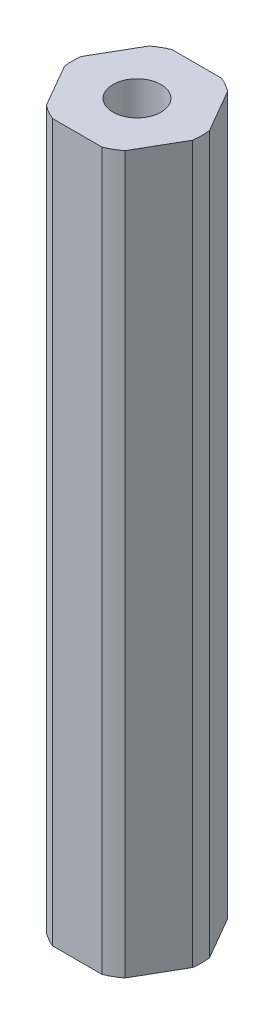
ISO-10303-21;
HEADER;
FILE_DESCRIPTION(('STEP AP214'),'2;1');
FILE_NAME('part.step','',(''),(''),'','','');
FILE_SCHEMA(('AUTOMOTIVE_DESIGN { 1 0 10303 214 1 1 1 1 }'));
ENDSEC;
DATA;
#1=APPLICATION_CONTEXT('core data for automotive mechanical design processes');
#2=APPLICATION_PROTOCOL_DEFINITION('international standard','automotive_design',2000,#1);
#3=PRODUCT_CONTEXT('',#1,'mechanical');
#4=PRODUCT('Part','Part','',(#3));
#5=PRODUCT_RELATED_PRODUCT_CATEGORY('part','',(#4));
#6=PRODUCT_DEFINITION_FORMATION('','',#4);
#7=PRODUCT_DEFINITION_CONTEXT('part definition',#1,'design');
#8=PRODUCT_DEFINITION('design','',#6,#7);
#9=PRODUCT_DEFINITION_SHAPE('','',#8);
#10=(LENGTH_UNIT() NAMED_UNIT(*) SI_UNIT(.MILLI.,.METRE.));
#11=(NAMED_UNIT(*) PLANE_ANGLE_UNIT() SI_UNIT($,.RADIAN.));
#12=(NAMED_UNIT(*) SI_UNIT($,.STERADIAN.) SOLID_ANGLE_UNIT());
#13=UNCERTAINTY_MEASURE_WITH_UNIT(LENGTH_MEASURE(1.E-05),#10,'distance_accuracy_value','');
#14=(GEOMETRIC_REPRESENTATION_CONTEXT(3) GLOBAL_UNCERTAINTY_ASSIGNED_CONTEXT((#13)) GLOBAL_UNIT_ASSIGNED_CONTEXT((#10,
#11,#12)) REPRESENTATION_CONTEXT('',''));
#15=CARTESIAN_POINT('',(0.,0.,0.));
#16=DIRECTION('',(0.,0.,1.));
#17=DIRECTION('',(1.,0.,0.));
#18=AXIS2_PLACEMENT_3D('',#15,#16,#17);
#19=CARTESIAN_POINT('',(0.,38.1,6.35));
#20=DIRECTION('',(0.,0.,-1.));
#21=DIRECTION('',(-1.,0.,0.));
#22=AXIS2_PLACEMENT_3D('',#19,#20,#21);
#23=PLANE('',#22);
#24=DIRECTION('',(1.,0.,0.));
#25=VECTOR('',#24,1.);
#26=CARTESIAN_POINT('',(0.,-38.1,6.35));
#27=LINE('',#26,#25);
#28=CARTESIAN_POINT('',(-2.63701547367474,-38.1,6.35));
#29=VERTEX_POINT('',#28);
#30=CARTESIAN_POINT('',(2.63701547367474,-38.1,6.35));
#31=VERTEX_POINT('',#30);
#32=EDGE_CURVE('E159',#29,#31,#27,.T.);
#33=ORIENTED_EDGE('',*,*,#32,.T.);
#34=DIRECTION('',(0.,-1.,0.));
#35=VECTOR('',#34,1.);
#36=CARTESIAN_POINT('',(2.63701547367474,38.1,6.35));
#37=LINE('',#36,#35);
#38=CARTESIAN_POINT('',(2.63701547367474,38.1,6.35));
#39=VERTEX_POINT('',#38);
#40=EDGE_CURVE('E11',#39,#31,#37,.T.);
#41=ORIENTED_EDGE('',*,*,#40,.F.);
#42=DIRECTION('',(1.,0.,0.));
#43=VECTOR('',#42,1.);
#44=CARTESIAN_POINT('',(0.,38.1,6.35));
#45=LINE('',#44,#43);
#46=CARTESIAN_POINT('',(-2.63701547367474,38.1,6.35));
#47=VERTEX_POINT('',#46);
#48=EDGE_CURVE('E218',#47,#39,#45,.T.);
#49=ORIENTED_EDGE('',*,*,#48,.F.);
#50=DIRECTION('',(0.,-1.,0.));
#51=VECTOR('',#50,1.);
#52=CARTESIAN_POINT('',(-2.63701547367474,38.1,6.35));
#53=LINE('',#52,#51);
#54=EDGE_CURVE('E152',#47,#29,#53,.T.);
#55=ORIENTED_EDGE('',*,*,#54,.T.);
#56=EDGE_LOOP('',(#33,#41,#49,#55));
#57=FACE_BOUND('',#56,.T.);
#58=ADVANCED_FACE('F34',(#57),#23,.F.);
#59=CARTESIAN_POINT('',(0.,38.1,0.));
#60=DIRECTION('',(0.,-1.,0.));
#61=DIRECTION('',(0.,0.,-1.));
#62=AXIS2_PLACEMENT_3D('',#59,#60,#61);
#63=CYLINDRICAL_SURFACE('',#62,6.87578);
#64=CARTESIAN_POINT('',(0.,-38.1,0.));
#65=DIRECTION('',(0.,1.,0.));
#66=DIRECTION('',(0.,0.,1.));
#67=AXIS2_PLACEMENT_3D('',#64,#65,#66);
#68=CIRCLE('',#67,6.87578);
#69=CARTESIAN_POINT('',(4.18075357719382,-38.1,5.45872239037497));
#70=VERTEX_POINT('',#69);
#71=EDGE_CURVE('E162',#31,#70,#68,.T.);
#72=ORIENTED_EDGE('',*,*,#71,.T.);
#73=DIRECTION('',(0.,-1.,0.));
#74=VECTOR('',#73,1.);
#75=CARTESIAN_POINT('',(4.18075357719382,38.1,5.45872239037497));
#76=LINE('',#75,#74);
#77=CARTESIAN_POINT('',(4.18075357719382,38.1,5.45872239037497));
#78=VERTEX_POINT('',#77);
#79=EDGE_CURVE('E43',#78,#70,#76,.T.);
#80=ORIENTED_EDGE('',*,*,#79,.F.);
#81=CARTESIAN_POINT('',(0.,38.1,0.));
#82=DIRECTION('',(0.,1.,0.));
#83=DIRECTION('',(0.,0.,1.));
#84=AXIS2_PLACEMENT_3D('',#81,#82,#83);
#85=CIRCLE('',#84,6.87578);
#86=EDGE_CURVE('E106',#39,#78,#85,.T.);
#87=ORIENTED_EDGE('',*,*,#86,.F.);
#88=ORIENTED_EDGE('',*,*,#40,.T.);
#89=EDGE_LOOP('',(#72,#80,#87,#88));
#90=FACE_BOUND('',#89,.T.);
#91=ADVANCED_FACE('F253',(#90),#63,.T.);
#92=CARTESIAN_POINT('',(5.49926131403119,38.1,3.175));
#93=DIRECTION('',(-0.866025403784439,0.,-0.5));
#94=DIRECTION('',(-0.5,0.,0.866025403784439));
#95=AXIS2_PLACEMENT_3D('',#92,#93,#94);
#96=PLANE('',#95);
#97=DIRECTION('',(0.5,0.,-0.866025403784439));
#98=VECTOR('',#97,1.);
#99=CARTESIAN_POINT('',(5.49926131403119,-38.1,3.175));
#100=LINE('',#99,#98);
#101=CARTESIAN_POINT('',(6.81776905086855,-38.1,0.891277609625022));
#102=VERTEX_POINT('',#101);
#103=EDGE_CURVE('E164',#70,#102,#100,.T.);
#104=ORIENTED_EDGE('',*,*,#103,.T.);
#105=DIRECTION('',(0.,-1.,0.));
#106=VECTOR('',#105,1.);
#107=CARTESIAN_POINT('',(6.81776905086855,38.1,0.891277609625022));
#108=LINE('',#107,#106);
#109=CARTESIAN_POINT('',(6.81776905086855,38.1,0.891277609625022));
#110=VERTEX_POINT('',#109);
#111=EDGE_CURVE('E194',#110,#102,#108,.T.);
#112=ORIENTED_EDGE('',*,*,#111,.F.);
#113=DIRECTION('',(0.5,0.,-0.866025403784439));
#114=VECTOR('',#113,1.);
#115=CARTESIAN_POINT('',(5.49926131403119,38.1,3.175));
#116=LINE('',#115,#114);
#117=EDGE_CURVE('E202',#78,#110,#116,.T.);
#118=ORIENTED_EDGE('',*,*,#117,.F.);
#119=ORIENTED_EDGE('',*,*,#79,.T.);
#120=EDGE_LOOP('',(#104,#112,#118,#119));
#121=FACE_BOUND('',#120,.T.);
#122=ADVANCED_FACE('F200',(#121),#96,.F.);
#123=CARTESIAN_POINT('',(6.81776905086856,-38.1,-0.891277609625022));
#124=VERTEX_POINT('',#123);
#125=EDGE_CURVE('E165',#102,#124,#68,.T.);
#126=ORIENTED_EDGE('',*,*,#125,.T.);
#127=DIRECTION('',(0.,-1.,0.));
#128=VECTOR('',#127,1.);
#129=CARTESIAN_POINT('',(6.81776905086856,38.1,-0.891277609625022));
#130=LINE('',#129,#128);
#131=CARTESIAN_POINT('',(6.81776905086856,38.1,-0.891277609625022));
#132=VERTEX_POINT('',#131);
#133=EDGE_CURVE('E191',#132,#124,#130,.T.);
#134=ORIENTED_EDGE('',*,*,#133,.F.);
#135=EDGE_CURVE('E224',#110,#132,#85,.T.);
#136=ORIENTED_EDGE('',*,*,#135,.F.);
#137=ORIENTED_EDGE('',*,*,#111,.T.);
#138=EDGE_LOOP('',(#126,#134,#136,#137));
#139=FACE_BOUND('',#138,.T.);
#140=ADVANCED_FACE('F235',(#139),#63,.T.);
#141=CARTESIAN_POINT('',(5.49926131403118,38.1,-3.175));
#142=DIRECTION('',(-0.866025403784438,0.,0.5));
#143=DIRECTION('',(0.5,0.,0.866025403784439));
#144=AXIS2_PLACEMENT_3D('',#141,#142,#143);
#145=PLANE('',#144);
#146=DIRECTION('',(-0.5,0.,-0.866025403784439));
#147=VECTOR('',#146,1.);
#148=CARTESIAN_POINT('',(5.49926131403118,-38.1,-3.175));
#149=LINE('',#148,#147);
#150=CARTESIAN_POINT('',(4.18075357719381,-38.1,-5.45872239037498));
#151=VERTEX_POINT('',#150);
#152=EDGE_CURVE('E167',#124,#151,#149,.T.);
#153=ORIENTED_EDGE('',*,*,#152,.T.);
#154=DIRECTION('',(0.,-1.,0.));
#155=VECTOR('',#154,1.);
#156=CARTESIAN_POINT('',(4.18075357719381,38.1,-5.45872239037498));
#157=LINE('',#156,#155);
#158=CARTESIAN_POINT('',(4.18075357719381,38.1,-5.45872239037498));
#159=VERTEX_POINT('',#158);
#160=EDGE_CURVE('E188',#159,#151,#157,.T.);
#161=ORIENTED_EDGE('',*,*,#160,.F.);
#162=DIRECTION('',(-0.5,0.,-0.866025403784439));
#163=VECTOR('',#162,1.);
#164=CARTESIAN_POINT('',(5.49926131403118,38.1,-3.175));
#165=LINE('',#164,#163);
#166=EDGE_CURVE('E226',#132,#159,#165,.T.);
#167=ORIENTED_EDGE('',*,*,#166,.F.);
#168=ORIENTED_EDGE('',*,*,#133,.T.);
#169=EDGE_LOOP('',(#153,#161,#167,#168));
#170=FACE_BOUND('',#169,.T.);
#171=ADVANCED_FACE('F237',(#170),#145,.F.);
#172=CARTESIAN_POINT('',(2.63701547367473,-38.1,-6.35));
#173=VERTEX_POINT('',#172);
#174=EDGE_CURVE('E169',#151,#173,#68,.T.);
#175=ORIENTED_EDGE('',*,*,#174,.T.);
#176=DIRECTION('',(0.,-1.,0.));
#177=VECTOR('',#176,1.);
#178=CARTESIAN_POINT('',(2.63701547367473,38.1,-6.35));
#179=LINE('',#178,#177);
#180=CARTESIAN_POINT('',(2.63701547367473,38.1,-6.35));
#181=VERTEX_POINT('',#180);
#182=EDGE_CURVE('E185',#181,#173,#179,.T.);
#183=ORIENTED_EDGE('',*,*,#182,.F.);
#184=EDGE_CURVE('E227',#159,#181,#85,.T.);
#185=ORIENTED_EDGE('',*,*,#184,.F.);
#186=ORIENTED_EDGE('',*,*,#160,.T.);
#187=EDGE_LOOP('',(#175,#183,#185,#186));
#188=FACE_BOUND('',#187,.T.);
#189=ADVANCED_FACE('F238',(#188),#63,.T.);
#190=CARTESIAN_POINT('',(0.,38.1,-6.35));
#191=DIRECTION('',(0.,0.,1.));
#192=DIRECTION('',(1.,0.,0.));
#193=AXIS2_PLACEMENT_3D('',#190,#191,#192);
#194=PLANE('',#193);
#195=DIRECTION('',(-1.,0.,0.));
#196=VECTOR('',#195,1.);
#197=CARTESIAN_POINT('',(0.,-38.1,-6.35));
#198=LINE('',#197,#196);
#199=CARTESIAN_POINT('',(-2.63701547367473,-38.1,-6.35));
#200=VERTEX_POINT('',#199);
#201=EDGE_CURVE('E170',#173,#200,#198,.T.);
#202=ORIENTED_EDGE('',*,*,#201,.T.);
#203=DIRECTION('',(0.,-1.,0.));
#204=VECTOR('',#203,1.);
#205=CARTESIAN_POINT('',(-2.63701547367473,38.1,-6.35));
#206=LINE('',#205,#204);
#207=CARTESIAN_POINT('',(-2.63701547367473,38.1,-6.35));
#208=VERTEX_POINT('',#207);
#209=EDGE_CURVE('E182',#208,#200,#206,.T.);
#210=ORIENTED_EDGE('',*,*,#209,.F.);
#211=DIRECTION('',(-1.,0.,0.));
#212=VECTOR('',#211,1.);
#213=CARTESIAN_POINT('',(0.,38.1,-6.35));
#214=LINE('',#213,#212);
#215=EDGE_CURVE('E228',#181,#208,#214,.T.);
#216=ORIENTED_EDGE('',*,*,#215,.F.);
#217=ORIENTED_EDGE('',*,*,#182,.T.);
#218=EDGE_LOOP('',(#202,#210,#216,#217));
#219=FACE_BOUND('',#218,.T.);
#220=ADVANCED_FACE('F241',(#219),#194,.F.);
#221=CARTESIAN_POINT('',(-4.18075357719382,-38.1,-5.45872239037497));
#222=VERTEX_POINT('',#221);
#223=EDGE_CURVE('E172',#200,#222,#68,.T.);
#224=ORIENTED_EDGE('',*,*,#223,.T.);
#225=DIRECTION('',(0.,-1.,0.));
#226=VECTOR('',#225,1.);
#227=CARTESIAN_POINT('',(-4.18075357719382,38.1,-5.45872239037497));
#228=LINE('',#227,#226);
#229=CARTESIAN_POINT('',(-4.18075357719382,38.1,-5.45872239037497));
#230=VERTEX_POINT('',#229);
#231=EDGE_CURVE('E179',#230,#222,#228,.T.);
#232=ORIENTED_EDGE('',*,*,#231,.F.);
#233=EDGE_CURVE('E142',#208,#230,#85,.T.);
#234=ORIENTED_EDGE('',*,*,#233,.F.);
#235=ORIENTED_EDGE('',*,*,#209,.T.);
#236=EDGE_LOOP('',(#224,#232,#234,#235));
#237=FACE_BOUND('',#236,.T.);
#238=ADVANCED_FACE('F243',(#237),#63,.T.);
#239=CARTESIAN_POINT('',(-5.49926131403119,38.1,-3.175));
#240=DIRECTION('',(0.866025403784439,0.,0.5));
#241=DIRECTION('',(0.5,0.,-0.866025403784438));
#242=AXIS2_PLACEMENT_3D('',#239,#240,#241);
#243=PLANE('',#242);
#244=DIRECTION('',(-0.5,0.,0.866025403784439));
#245=VECTOR('',#244,1.);
#246=CARTESIAN_POINT('',(-5.49926131403119,-38.1,-3.175));
#247=LINE('',#246,#245);
#248=CARTESIAN_POINT('',(-6.81776905086855,-38.1,-0.891277609625031));
#249=VERTEX_POINT('',#248);
#250=EDGE_CURVE('E173',#222,#249,#247,.T.);
#251=ORIENTED_EDGE('',*,*,#250,.T.);
#252=DIRECTION('',(0.,-1.,0.));
#253=VECTOR('',#252,1.);
#254=CARTESIAN_POINT('',(-6.81776905086855,38.1,-0.891277609625031));
#255=LINE('',#254,#253);
#256=CARTESIAN_POINT('',(-6.81776905086855,38.1,-0.891277609625031));
#257=VERTEX_POINT('',#256);
#258=EDGE_CURVE('E147',#257,#249,#255,.T.);
#259=ORIENTED_EDGE('',*,*,#258,.F.);
#260=DIRECTION('',(-0.5,0.,0.866025403784439));
#261=VECTOR('',#260,1.);
#262=CARTESIAN_POINT('',(-5.49926131403119,38.1,-3.175));
#263=LINE('',#262,#261);
#264=EDGE_CURVE('E137',#230,#257,#263,.T.);
#265=ORIENTED_EDGE('',*,*,#264,.F.);
#266=ORIENTED_EDGE('',*,*,#231,.T.);
#267=EDGE_LOOP('',(#251,#259,#265,#266));
#268=FACE_BOUND('',#267,.T.);
#269=ADVANCED_FACE('F246',(#268),#243,.F.);
#270=CARTESIAN_POINT('',(-6.81776905086855,-38.1,0.891277609625025));
#271=VERTEX_POINT('',#270);
#272=EDGE_CURVE('E146',#249,#271,#68,.T.);
#273=ORIENTED_EDGE('',*,*,#272,.T.);
#274=DIRECTION('',(0.,-1.,0.));
#275=VECTOR('',#274,1.);
#276=CARTESIAN_POINT('',(-6.81776905086855,38.1,0.891277609625025));
#277=LINE('',#276,#275);
#278=CARTESIAN_POINT('',(-6.81776905086855,38.1,0.891277609625025));
#279=VERTEX_POINT('',#278);
#280=EDGE_CURVE('E143',#279,#271,#277,.T.);
#281=ORIENTED_EDGE('',*,*,#280,.F.);
#282=EDGE_CURVE('E131',#257,#279,#85,.T.);
#283=ORIENTED_EDGE('',*,*,#282,.F.);
#284=ORIENTED_EDGE('',*,*,#258,.T.);
#285=EDGE_LOOP('',(#273,#281,#283,#284));
#286=FACE_BOUND('',#285,.T.);
#287=ADVANCED_FACE('F144',(#286),#63,.T.);
#288=CARTESIAN_POINT('',(-5.49926131403118,38.1,3.175));
#289=DIRECTION('',(0.866025403784438,0.,-0.5));
#290=DIRECTION('',(-0.5,0.,-0.866025403784438));
#291=AXIS2_PLACEMENT_3D('',#288,#289,#290);
#292=PLANE('',#291);
#293=DIRECTION('',(0.5,0.,0.866025403784438));
#294=VECTOR('',#293,1.);
#295=CARTESIAN_POINT('',(-5.49926131403118,-38.1,3.175));
#296=LINE('',#295,#294);
#297=CARTESIAN_POINT('',(-4.18075357719381,-38.1,5.45872239037498));
#298=VERTEX_POINT('',#297);
#299=EDGE_CURVE('E92',#271,#298,#296,.T.);
#300=ORIENTED_EDGE('',*,*,#299,.T.);
#301=DIRECTION('',(0.,-1.,0.));
#302=VECTOR('',#301,1.);
#303=CARTESIAN_POINT('',(-4.18075357719381,38.1,5.45872239037498));
#304=LINE('',#303,#302);
#305=CARTESIAN_POINT('',(-4.18075357719381,38.1,5.45872239037498));
#306=VERTEX_POINT('',#305);
#307=EDGE_CURVE('E148',#306,#298,#304,.T.);
#308=ORIENTED_EDGE('',*,*,#307,.F.);
#309=DIRECTION('',(0.5,0.,0.866025403784438));
#310=VECTOR('',#309,1.);
#311=CARTESIAN_POINT('',(-5.49926131403118,38.1,3.175));
#312=LINE('',#311,#310);
#313=EDGE_CURVE('E135',#279,#306,#312,.T.);
#314=ORIENTED_EDGE('',*,*,#313,.F.);
#315=ORIENTED_EDGE('',*,*,#280,.T.);
#316=EDGE_LOOP('',(#300,#308,#314,#315));
#317=FACE_BOUND('',#316,.T.);
#318=ADVANCED_FACE('F150',(#317),#292,.F.);
#319=CARTESIAN_POINT('',(0.,38.1,0.));
#320=DIRECTION('',(0.,-1.,0.));
#321=DIRECTION('',(0.,0.,-1.));
#322=AXIS2_PLACEMENT_3D('',#319,#320,#321);
#323=CYLINDRICAL_SURFACE('',#322,2.5527);
#324=CARTESIAN_POINT('',(0.,38.1,0.));
#325=DIRECTION('',(0.,1.,0.));
#326=DIRECTION('',(0.,0.,1.));
#327=AXIS2_PLACEMENT_3D('',#324,#325,#326);
#328=CIRCLE('',#327,2.5527);
#329=CARTESIAN_POINT('',(0.,38.1,-2.5527));
#330=VERTEX_POINT('',#329);
#331=EDGE_CURVE('E216',#330,#330,#328,.T.);
#332=CARTESIAN_POINT('',(0.,-38.1,0.));
#333=DIRECTION('',(0.,1.,0.));
#334=DIRECTION('',(0.,0.,1.));
#335=AXIS2_PLACEMENT_3D('',#332,#333,#334);
#336=CIRCLE('',#335,2.5527);
#337=CARTESIAN_POINT('',(0.,-38.1,-2.5527));
#338=VERTEX_POINT('',#337);
#339=EDGE_CURVE('E156',#338,#338,#336,.T.);
#340=CARTESIAN_POINT('',(0.,38.1,-2.5527));
#341=CARTESIAN_POINT('',(0.,37.30625,-2.5527));
#342=CARTESIAN_POINT('',(0.,36.5125,-2.5527));
#343=CARTESIAN_POINT('',(0.,34.925,-2.5527));
#344=CARTESIAN_POINT('',(0.,34.13125,-2.5527));
#345=CARTESIAN_POINT('',(0.,32.54375,-2.5527));
#346=CARTESIAN_POINT('',(0.,31.75,-2.5527));
#347=CARTESIAN_POINT('',(0.,30.1625,-2.5527));
#348=CARTESIAN_POINT('',(0.,29.36875,-2.5527));
#349=CARTESIAN_POINT('',(0.,27.78125,-2.5527));
#350=CARTESIAN_POINT('',(0.,26.9875,-2.5527));
#351=CARTESIAN_POINT('',(0.,25.4,-2.5527));
#352=CARTESIAN_POINT('',(0.,24.60625,-2.5527));
#353=CARTESIAN_POINT('',(0.,23.01875,-2.5527));
#354=CARTESIAN_POINT('',(0.,22.225,-2.5527));
#355=CARTESIAN_POINT('',(0.,20.6375,-2.5527));
#356=CARTESIAN_POINT('',(0.,19.84375,-2.5527));
#357=CARTESIAN_POINT('',(0.,18.25625,-2.5527));
#358=CARTESIAN_POINT('',(0.,17.4625,-2.5527));
#359=CARTESIAN_POINT('',(0.,15.875,-2.5527));
#360=CARTESIAN_POINT('',(0.,15.08125,-2.5527));
#361=CARTESIAN_POINT('',(0.,13.49375,-2.5527));
#362=CARTESIAN_POINT('',(0.,12.7,-2.5527));
#363=CARTESIAN_POINT('',(0.,11.1125,-2.5527));
#364=CARTESIAN_POINT('',(0.,10.31875,-2.5527));
#365=CARTESIAN_POINT('',(0.,8.73124999999999,-2.5527));
#366=CARTESIAN_POINT('',(0.,7.93749999999999,-2.5527));
#367=CARTESIAN_POINT('',(0.,6.35,-2.5527));
#368=CARTESIAN_POINT('',(0.,5.55625,-2.5527));
#369=CARTESIAN_POINT('',(0.,3.96875,-2.5527));
#370=CARTESIAN_POINT('',(0.,3.175,-2.5527));
#371=CARTESIAN_POINT('',(0.,1.5875,-2.5527));
#372=CARTESIAN_POINT('',(0.,0.793750000000001,-2.5527));
#373=CARTESIAN_POINT('',(0.,-0.793750000000001,-2.5527));
#374=CARTESIAN_POINT('',(0.,-1.5875,-2.5527));
#375=CARTESIAN_POINT('',(0.,-3.175,-2.5527));
#376=CARTESIAN_POINT('',(0.,-3.96875,-2.5527));
#377=CARTESIAN_POINT('',(0.,-5.55625,-2.5527));
#378=CARTESIAN_POINT('',(0.,-6.35,-2.5527));
#379=CARTESIAN_POINT('',(0.,-7.93750000000001,-2.5527));
#380=CARTESIAN_POINT('',(0.,-8.73125,-2.5527));
#381=CARTESIAN_POINT('',(0.,-10.31875,-2.5527));
#382=CARTESIAN_POINT('',(0.,-11.1125,-2.5527));
#383=CARTESIAN_POINT('',(0.,-12.7,-2.5527));
#384=CARTESIAN_POINT('',(0.,-13.49375,-2.5527));
#385=CARTESIAN_POINT('',(0.,-15.08125,-2.5527));
#386=CARTESIAN_POINT('',(0.,-15.875,-2.5527));
#387=CARTESIAN_POINT('',(0.,-17.4625,-2.5527));
#388=CARTESIAN_POINT('',(0.,-18.25625,-2.5527));
#389=CARTESIAN_POINT('',(0.,-19.84375,-2.5527));
#390=CARTESIAN_POINT('',(0.,-20.6375,-2.5527));
#391=CARTESIAN_POINT('',(0.,-22.225,-2.5527));
#392=CARTESIAN_POINT('',(0.,-23.01875,-2.5527));
#393=CARTESIAN_POINT('',(0.,-24.60625,-2.5527));
#394=CARTESIAN_POINT('',(0.,-25.4,-2.5527));
#395=CARTESIAN_POINT('',(0.,-26.9875,-2.5527));
#396=CARTESIAN_POINT('',(0.,-27.78125,-2.5527));
#397=CARTESIAN_POINT('',(0.,-29.36875,-2.5527));
#398=CARTESIAN_POINT('',(0.,-30.1625,-2.5527));
#399=CARTESIAN_POINT('',(0.,-31.75,-2.5527));
#400=CARTESIAN_POINT('',(0.,-32.54375,-2.5527));
#401=CARTESIAN_POINT('',(0.,-34.13125,-2.5527));
#402=CARTESIAN_POINT('',(0.,-34.925,-2.5527));
#403=CARTESIAN_POINT('',(0.,-36.5125,-2.5527));
#404=CARTESIAN_POINT('',(0.,-37.30625,-2.5527));
#405=CARTESIAN_POINT('',(0.,-38.1,-2.5527));
#406=B_SPLINE_CURVE_WITH_KNOTS('',3,(#340,#341,#342,#343,#344,#345,#346,#347,#348,#349,#350,
#351,#352,#353,#354,#355,#356,#357,#358,#359,#360,#361,#362,#363,#364,#365,#366,#367,#368,#369,
#370,#371,#372,#373,#374,#375,#376,#377,#378,#379,#380,#381,#382,#383,#384,#385,#386,#387,#388,
#389,#390,#391,#392,#393,#394,#395,#396,#397,#398,#399,#400,#401,#402,#403,#404,#405),
.UNSPECIFIED.,.F.,.F.,(4,2,2,2,2,2,2,2,2,2,2,2,2,2,2,2,2,2,2,2,2,2,2,2,2,2,2,2,2,2,2,2,4),(0.,
2.38125,4.7625,7.14375,9.52500000000001,11.90625,14.2875,16.66875,19.05,21.43125,23.8125,
26.19375,28.575,30.95625,33.3375,35.71875,38.1,40.48125,42.8625,45.24375,47.625,50.00625,
52.3875,54.76875,57.15,59.53125,61.9125,64.29375,66.675,69.05625,71.4375,73.81875,76.2),.UNSPECIFIED.);
#407=EDGE_CURVE('BSEAM36',#330,#338,#406,.T.);
#408=ORIENTED_EDGE('',*,*,#331,.T.);
#409=ORIENTED_EDGE('',*,*,#339,.F.);
#410=ORIENTED_EDGE('',*,*,#407,.T.);
#411=ORIENTED_EDGE('',*,*,#407,.F.);
#412=EDGE_LOOP('',(#408,#410,#409,#411));
#413=FACE_BOUND('',#412,.T.);
#414=ADVANCED_FACE('F36',(#413),#323,.F.);
#415=EDGE_CURVE('E98',#298,#29,#68,.T.);
#416=ORIENTED_EDGE('',*,*,#415,.T.);
#417=ORIENTED_EDGE('',*,*,#54,.F.);
#418=EDGE_CURVE('E51',#306,#47,#85,.T.);
#419=ORIENTED_EDGE('',*,*,#418,.F.);
#420=ORIENTED_EDGE('',*,*,#307,.T.);
#421=EDGE_LOOP('',(#416,#417,#419,#420));
#422=FACE_BOUND('',#421,.T.);
#423=ADVANCED_FACE('F250',(#422),#63,.T.);
#424=CARTESIAN_POINT('',(0.,38.1,0.));
#425=DIRECTION('',(0.,1.,0.));
#426=DIRECTION('',(0.,0.,1.));
#427=AXIS2_PLACEMENT_3D('',#424,#425,#426);
#428=PLANE('',#427);
#429=ORIENTED_EDGE('',*,*,#331,.F.);
#430=EDGE_LOOP('',(#429));
#431=FACE_BOUND('',#430,.T.);
#432=ORIENTED_EDGE('',*,*,#48,.T.);
#433=ORIENTED_EDGE('',*,*,#86,.T.);
#434=ORIENTED_EDGE('',*,*,#117,.T.);
#435=ORIENTED_EDGE('',*,*,#135,.T.);
#436=ORIENTED_EDGE('',*,*,#166,.T.);
#437=ORIENTED_EDGE('',*,*,#184,.T.);
#438=ORIENTED_EDGE('',*,*,#215,.T.);
#439=ORIENTED_EDGE('',*,*,#233,.T.);
#440=ORIENTED_EDGE('',*,*,#264,.T.);
#441=ORIENTED_EDGE('',*,*,#282,.T.);
#442=ORIENTED_EDGE('',*,*,#313,.T.);
#443=ORIENTED_EDGE('',*,*,#418,.T.);
#444=EDGE_LOOP('',(#432,#433,#434,#435,#436,#437,#438,#439,#440,#441,#442,#443));
#445=FACE_BOUND('',#444,.T.);
#446=ADVANCED_FACE('F133',(#431,#445),#428,.T.);
#447=CARTESIAN_POINT('',(0.,-38.1,0.));
#448=DIRECTION('',(0.,1.,0.));
#449=DIRECTION('',(0.,0.,1.));
#450=AXIS2_PLACEMENT_3D('',#447,#448,#449);
#451=PLANE('',#450);
#452=ORIENTED_EDGE('',*,*,#339,.T.);
#453=EDGE_LOOP('',(#452));
#454=FACE_BOUND('',#453,.T.);
#455=ORIENTED_EDGE('',*,*,#32,.F.);
#456=ORIENTED_EDGE('',*,*,#415,.F.);
#457=ORIENTED_EDGE('',*,*,#299,.F.);
#458=ORIENTED_EDGE('',*,*,#272,.F.);
#459=ORIENTED_EDGE('',*,*,#250,.F.);
#460=ORIENTED_EDGE('',*,*,#223,.F.);
#461=ORIENTED_EDGE('',*,*,#201,.F.);
#462=ORIENTED_EDGE('',*,*,#174,.F.);
#463=ORIENTED_EDGE('',*,*,#152,.F.);
#464=ORIENTED_EDGE('',*,*,#125,.F.);
#465=ORIENTED_EDGE('',*,*,#103,.F.);
#466=ORIENTED_EDGE('',*,*,#71,.F.);
#467=EDGE_LOOP('',(#455,#456,#457,#458,#459,#460,#461,#462,#463,#464,#465,#466));
#468=FACE_BOUND('',#467,.T.);
#469=ADVANCED_FACE('F206',(#454,#468),#451,.F.);
#470=CLOSED_SHELL('',(#58,#91,#122,#140,#171,#189,#220,#238,#269,#287,#318,#414,#423,#446,#469));
#471=MANIFOLD_SOLID_BREP('B2',#470);
#472=ADVANCED_BREP_SHAPE_REPRESENTATION('',(#18,#471),#14);
#473=SHAPE_DEFINITION_REPRESENTATION(#9,#472);
ENDSEC;
END-ISO-10303-21;
